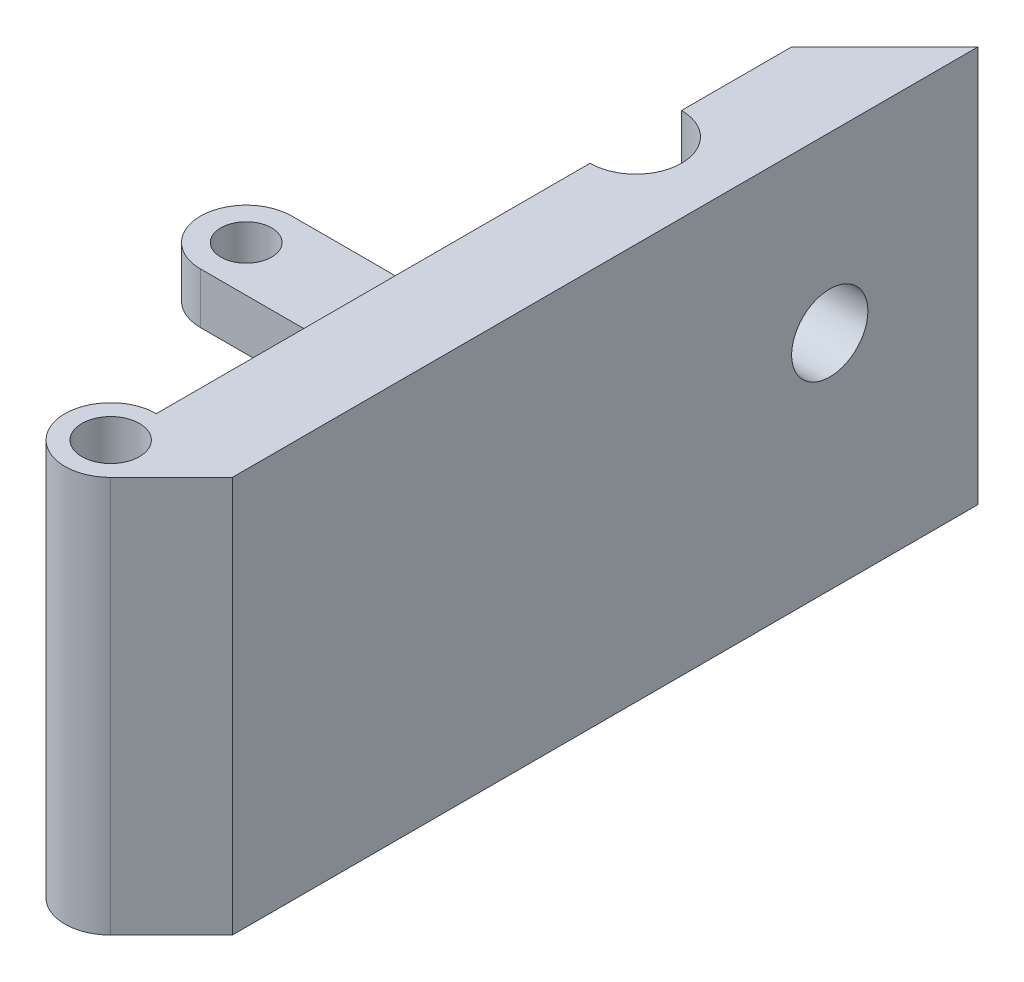
ISO-10303-21;
HEADER;
FILE_DESCRIPTION(('STEP AP214'),'2;1');
FILE_NAME('part.step','',(''),(''),'','','');
FILE_SCHEMA(('AUTOMOTIVE_DESIGN { 1 0 10303 214 1 1 1 1 }'));
ENDSEC;
DATA;
#1=APPLICATION_CONTEXT('core data for automotive mechanical design processes');
#2=APPLICATION_PROTOCOL_DEFINITION('international standard','automotive_design',2000,#1);
#3=PRODUCT_CONTEXT('',#1,'mechanical');
#4=PRODUCT('Part','Part','',(#3));
#5=PRODUCT_RELATED_PRODUCT_CATEGORY('part','',(#4));
#6=PRODUCT_DEFINITION_FORMATION('','',#4);
#7=PRODUCT_DEFINITION_CONTEXT('part definition',#1,'design');
#8=PRODUCT_DEFINITION('design','',#6,#7);
#9=PRODUCT_DEFINITION_SHAPE('','',#8);
#10=(LENGTH_UNIT() NAMED_UNIT(*) SI_UNIT(.MILLI.,.METRE.));
#11=(NAMED_UNIT(*) PLANE_ANGLE_UNIT() SI_UNIT($,.RADIAN.));
#12=(NAMED_UNIT(*) SI_UNIT($,.STERADIAN.) SOLID_ANGLE_UNIT());
#13=UNCERTAINTY_MEASURE_WITH_UNIT(LENGTH_MEASURE(1.E-05),#10,'distance_accuracy_value','');
#14=(GEOMETRIC_REPRESENTATION_CONTEXT(3) GLOBAL_UNCERTAINTY_ASSIGNED_CONTEXT((#13)) GLOBAL_UNIT_ASSIGNED_CONTEXT((#10,
#11,#12)) REPRESENTATION_CONTEXT('',''));
#15=CARTESIAN_POINT('',(0.,0.,0.));
#16=DIRECTION('',(0.,0.,1.));
#17=DIRECTION('',(1.,0.,0.));
#18=AXIS2_PLACEMENT_3D('',#15,#16,#17);
#19=CARTESIAN_POINT('',(60.,11.7,-56.7));
#20=DIRECTION('',(1.,0.,0.));
#21=DIRECTION('',(0.,0.,-1.));
#22=AXIS2_PLACEMENT_3D('',#19,#20,#21);
#23=PLANE('',#22);
#24=DIRECTION('',(0.,0.,1.));
#25=VECTOR('',#24,1.);
#26=CARTESIAN_POINT('',(60.,-6.7,-66.8));
#27=LINE('',#26,#25);
#28=CARTESIAN_POINT('',(60.,-6.7,-72.2));
#29=VERTEX_POINT('',#28);
#30=CARTESIAN_POINT('',(60.,-6.7,-66.8));
#31=VERTEX_POINT('',#30);
#32=EDGE_CURVE('E221',#29,#31,#27,.T.);
#33=ORIENTED_EDGE('',*,*,#32,.T.);
#34=DIRECTION('',(0.,-1.,0.));
#35=VECTOR('',#34,1.);
#36=CARTESIAN_POINT('',(60.,-6.7,-66.8));
#37=LINE('',#36,#35);
#38=CARTESIAN_POINT('',(60.,-9.7,-66.8));
#39=VERTEX_POINT('',#38);
#40=EDGE_CURVE('E244',#31,#39,#37,.T.);
#41=ORIENTED_EDGE('',*,*,#40,.T.);
#42=DIRECTION('',(0.,0.,1.));
#43=VECTOR('',#42,1.);
#44=CARTESIAN_POINT('',(60.,-9.7,-66.8));
#45=LINE('',#44,#43);
#46=CARTESIAN_POINT('',(60.,-9.7,-72.2));
#47=VERTEX_POINT('',#46);
#48=EDGE_CURVE('E234',#47,#39,#45,.T.);
#49=ORIENTED_EDGE('',*,*,#48,.F.);
#50=DIRECTION('',(0.,-1.,0.));
#51=VECTOR('',#50,1.);
#52=CARTESIAN_POINT('',(60.,-6.7,-72.2));
#53=LINE('',#52,#51);
#54=EDGE_CURVE('E248',#29,#47,#53,.T.);
#55=ORIENTED_EDGE('',*,*,#54,.F.);
#56=EDGE_LOOP('',(#33,#41,#49,#55));
#57=FACE_BOUND('',#56,.T.);
#58=DIRECTION('',(0.,0.,1.));
#59=VECTOR('',#58,1.);
#60=CARTESIAN_POINT('',(60.,-11.7,-56.7));
#61=LINE('',#60,#59);
#62=CARTESIAN_POINT('',(60.,-11.7,-82.3));
#63=VERTEX_POINT('',#62);
#64=CARTESIAN_POINT('',(60.,-11.7,-56.7));
#65=VERTEX_POINT('',#64);
#66=EDGE_CURVE('E297',#63,#65,#61,.T.);
#67=ORIENTED_EDGE('',*,*,#66,.T.);
#68=DIRECTION('',(0.,-1.,0.));
#69=VECTOR('',#68,1.);
#70=CARTESIAN_POINT('',(60.,11.7,-56.7));
#71=LINE('',#70,#69);
#72=CARTESIAN_POINT('',(60.,11.7,-56.7));
#73=VERTEX_POINT('',#72);
#74=EDGE_CURVE('E327',#73,#65,#71,.T.);
#75=ORIENTED_EDGE('',*,*,#74,.F.);
#76=DIRECTION('',(0.,0.,1.));
#77=VECTOR('',#76,1.);
#78=CARTESIAN_POINT('',(60.,11.7,-56.7));
#79=LINE('',#78,#77);
#80=CARTESIAN_POINT('',(60.,11.7,-82.3));
#81=VERTEX_POINT('',#80);
#82=EDGE_CURVE('E276',#81,#73,#79,.T.);
#83=ORIENTED_EDGE('',*,*,#82,.F.);
#84=DIRECTION('',(0.,-1.,0.));
#85=VECTOR('',#84,1.);
#86=CARTESIAN_POINT('',(60.,11.7,-82.3));
#87=LINE('',#86,#85);
#88=EDGE_CURVE('E48',#81,#63,#87,.T.);
#89=ORIENTED_EDGE('',*,*,#88,.T.);
#90=EDGE_LOOP('',(#67,#75,#83,#89));
#91=FACE_BOUND('',#90,.T.);
#92=DIRECTION('',(0.,0.,1.));
#93=VECTOR('',#92,1.);
#94=CARTESIAN_POINT('',(60.,10.3,-66.8));
#95=LINE('',#94,#93);
#96=CARTESIAN_POINT('',(60.,10.3,-72.2));
#97=VERTEX_POINT('',#96);
#98=CARTESIAN_POINT('',(60.,10.3,-66.8));
#99=VERTEX_POINT('',#98);
#100=EDGE_CURVE('E167',#97,#99,#95,.T.);
#101=ORIENTED_EDGE('',*,*,#100,.T.);
#102=DIRECTION('',(0.,-1.,0.));
#103=VECTOR('',#102,1.);
#104=CARTESIAN_POINT('',(60.,10.3,-66.8));
#105=LINE('',#104,#103);
#106=CARTESIAN_POINT('',(60.,7.3,-66.8));
#107=VERTEX_POINT('',#106);
#108=EDGE_CURVE('E198',#99,#107,#105,.T.);
#109=ORIENTED_EDGE('',*,*,#108,.T.);
#110=DIRECTION('',(0.,0.,1.));
#111=VECTOR('',#110,1.);
#112=CARTESIAN_POINT('',(60.,7.3,-66.8));
#113=LINE('',#112,#111);
#114=CARTESIAN_POINT('',(60.,7.3,-72.2));
#115=VERTEX_POINT('',#114);
#116=EDGE_CURVE('E177',#115,#107,#113,.T.);
#117=ORIENTED_EDGE('',*,*,#116,.F.);
#118=DIRECTION('',(0.,-1.,0.));
#119=VECTOR('',#118,1.);
#120=CARTESIAN_POINT('',(60.,10.3,-72.2));
#121=LINE('',#120,#119);
#122=EDGE_CURVE('E157',#97,#115,#121,.T.);
#123=ORIENTED_EDGE('',*,*,#122,.F.);
#124=EDGE_LOOP('',(#101,#109,#117,#123));
#125=FACE_BOUND('',#124,.T.);
#126=ADVANCED_FACE('F39',(#57,#91,#125),#23,.F.);
#127=CARTESIAN_POINT('',(60.,11.7,-54.));
#128=DIRECTION('',(0.,1.,0.));
#129=DIRECTION('',(0.,0.,1.));
#130=AXIS2_PLACEMENT_3D('',#127,#128,#129);
#131=PLANE('',#130);
#132=DIRECTION('',(0.,0.,1.));
#133=VECTOR('',#132,1.);
#134=CARTESIAN_POINT('',(60.,11.7,-93.2));
#135=LINE('',#134,#133);
#136=CARTESIAN_POINT('',(60.,11.7,-94.2));
#137=VERTEX_POINT('',#136);
#138=CARTESIAN_POINT('',(60.,11.7,-87.7));
#139=VERTEX_POINT('',#138);
#140=EDGE_CURVE('E269',#137,#139,#135,.T.);
#141=ORIENTED_EDGE('',*,*,#140,.T.);
#142=CARTESIAN_POINT('',(60.,11.7,-85.));
#143=DIRECTION('',(0.,-1.,0.));
#144=DIRECTION('',(0.,0.,1.));
#145=AXIS2_PLACEMENT_3D('',#142,#143,#144);
#146=CIRCLE('',#145,2.69999999999999);
#147=EDGE_CURVE('E272',#139,#81,#146,.T.);
#148=ORIENTED_EDGE('',*,*,#147,.T.);
#149=ORIENTED_EDGE('',*,*,#82,.T.);
#150=CARTESIAN_POINT('',(60.,11.7,-54.));
#151=DIRECTION('',(0.,1.,0.));
#152=DIRECTION('',(0.,0.,1.));
#153=AXIS2_PLACEMENT_3D('',#150,#151,#152);
#154=CIRCLE('',#153,2.7);
#155=CARTESIAN_POINT('',(61.9091883092037,11.7,-52.0908116907963));
#156=VERTEX_POINT('',#155);
#157=EDGE_CURVE('E279',#73,#156,#154,.T.);
#158=ORIENTED_EDGE('',*,*,#157,.T.);
#159=DIRECTION('',(0.707106781186543,0.,-0.707106781186552));
#160=VECTOR('',#159,1.);
#161=CARTESIAN_POINT('',(61.9091883092037,11.7,-52.0908116907963));
#162=LINE('',#161,#160);
#163=CARTESIAN_POINT('',(65.5,11.7,-55.6816233815927));
#164=VERTEX_POINT('',#163);
#165=EDGE_CURVE('E282',#156,#164,#162,.T.);
#166=ORIENTED_EDGE('',*,*,#165,.T.);
#167=DIRECTION('',(0.,0.,-1.));
#168=VECTOR('',#167,1.);
#169=CARTESIAN_POINT('',(65.5,11.7,-99.7));
#170=LINE('',#169,#168);
#171=CARTESIAN_POINT('',(65.5,11.7,-99.7));
#172=VERTEX_POINT('',#171);
#173=EDGE_CURVE('E285',#164,#172,#170,.T.);
#174=ORIENTED_EDGE('',*,*,#173,.T.);
#175=DIRECTION('',(-0.707106781186548,0.,0.707106781186547));
#176=VECTOR('',#175,1.);
#177=CARTESIAN_POINT('',(60.,11.7,-94.2));
#178=LINE('',#177,#176);
#179=EDGE_CURVE('E288',#172,#137,#178,.T.);
#180=ORIENTED_EDGE('',*,*,#179,.T.);
#181=EDGE_LOOP('',(#141,#148,#149,#158,#166,#174,#180));
#182=FACE_BOUND('',#181,.T.);
#183=CARTESIAN_POINT('',(60.,11.7,-54.));
#184=DIRECTION('',(0.,1.,0.));
#185=DIRECTION('',(0.,0.,1.));
#186=AXIS2_PLACEMENT_3D('',#183,#184,#185);
#187=CIRCLE('',#186,1.7);
#188=CARTESIAN_POINT('',(60.,11.7,-52.3));
#189=VERTEX_POINT('',#188);
#190=EDGE_CURVE('E261',#189,#189,#187,.T.);
#191=ORIENTED_EDGE('',*,*,#190,.F.);
#192=EDGE_LOOP('',(#191));
#193=FACE_BOUND('',#192,.T.);
#194=ADVANCED_FACE('F357',(#182,#193),#131,.T.);
#195=CARTESIAN_POINT('',(60.,-11.7,-54.));
#196=DIRECTION('',(0.,1.,0.));
#197=DIRECTION('',(0.,0.,1.));
#198=AXIS2_PLACEMENT_3D('',#195,#196,#197);
#199=PLANE('',#198);
#200=DIRECTION('',(0.,0.,1.));
#201=VECTOR('',#200,1.);
#202=CARTESIAN_POINT('',(60.,-11.7,-87.7));
#203=LINE('',#202,#201);
#204=CARTESIAN_POINT('',(60.,-11.7,-94.2));
#205=VERTEX_POINT('',#204);
#206=CARTESIAN_POINT('',(60.,-11.7,-87.7));
#207=VERTEX_POINT('',#206);
#208=EDGE_CURVE('E265',#205,#207,#203,.T.);
#209=ORIENTED_EDGE('',*,*,#208,.F.);
#210=DIRECTION('',(-0.707106781186548,0.,0.707106781186547));
#211=VECTOR('',#210,1.);
#212=CARTESIAN_POINT('',(60.,-11.7,-94.2));
#213=LINE('',#212,#211);
#214=CARTESIAN_POINT('',(65.5,-11.7,-99.7));
#215=VERTEX_POINT('',#214);
#216=EDGE_CURVE('E273',#215,#205,#213,.T.);
#217=ORIENTED_EDGE('',*,*,#216,.F.);
#218=DIRECTION('',(0.,0.,-1.));
#219=VECTOR('',#218,1.);
#220=CARTESIAN_POINT('',(65.5,-11.7,-99.7));
#221=LINE('',#220,#219);
#222=CARTESIAN_POINT('',(65.5,-11.7,-55.6816233815927));
#223=VERTEX_POINT('',#222);
#224=EDGE_CURVE('E306',#223,#215,#221,.T.);
#225=ORIENTED_EDGE('',*,*,#224,.F.);
#226=DIRECTION('',(0.707106781186543,0.,-0.707106781186552));
#227=VECTOR('',#226,1.);
#228=CARTESIAN_POINT('',(61.9091883092037,-11.7,-52.0908116907963));
#229=LINE('',#228,#227);
#230=CARTESIAN_POINT('',(61.9091883092037,-11.7,-52.0908116907963));
#231=VERTEX_POINT('',#230);
#232=EDGE_CURVE('E303',#231,#223,#229,.T.);
#233=ORIENTED_EDGE('',*,*,#232,.F.);
#234=CARTESIAN_POINT('',(60.,-11.7,-54.));
#235=DIRECTION('',(0.,1.,0.));
#236=DIRECTION('',(0.,0.,1.));
#237=AXIS2_PLACEMENT_3D('',#234,#235,#236);
#238=CIRCLE('',#237,2.7);
#239=EDGE_CURVE('E300',#65,#231,#238,.T.);
#240=ORIENTED_EDGE('',*,*,#239,.F.);
#241=ORIENTED_EDGE('',*,*,#66,.F.);
#242=CARTESIAN_POINT('',(60.,-11.7,-85.));
#243=DIRECTION('',(0.,-1.,0.));
#244=DIRECTION('',(0.,0.,1.));
#245=AXIS2_PLACEMENT_3D('',#242,#243,#244);
#246=CIRCLE('',#245,2.69999999999999);
#247=EDGE_CURVE('E294',#207,#63,#246,.T.);
#248=ORIENTED_EDGE('',*,*,#247,.F.);
#249=EDGE_LOOP('',(#209,#217,#225,#233,#240,#241,#248));
#250=FACE_BOUND('',#249,.T.);
#251=CARTESIAN_POINT('',(60.,-11.7,-54.));
#252=DIRECTION('',(0.,1.,0.));
#253=DIRECTION('',(0.,0.,1.));
#254=AXIS2_PLACEMENT_3D('',#251,#252,#253);
#255=CIRCLE('',#254,1.7);
#256=CARTESIAN_POINT('',(60.,-11.7,-52.3));
#257=VERTEX_POINT('',#256);
#258=EDGE_CURVE('E260',#257,#257,#255,.T.);
#259=ORIENTED_EDGE('',*,*,#258,.T.);
#260=EDGE_LOOP('',(#259));
#261=FACE_BOUND('',#260,.T.);
#262=ADVANCED_FACE('F343',(#250,#261),#199,.F.);
#263=CARTESIAN_POINT('',(60.,11.7,-87.7));
#264=DIRECTION('',(1.,0.,0.));
#265=DIRECTION('',(0.,0.,-1.));
#266=AXIS2_PLACEMENT_3D('',#263,#264,#265);
#267=PLANE('',#266);
#268=CARTESIAN_POINT('',(60.,1.45,-90.95));
#269=DIRECTION('',(1.,0.,0.));
#270=DIRECTION('',(0.,0.,-1.));
#271=AXIS2_PLACEMENT_3D('',#268,#269,#270);
#272=CIRCLE('',#271,2.25);
#273=CARTESIAN_POINT('',(60.,1.45,-93.2));
#274=VERTEX_POINT('',#273);
#275=EDGE_CURVE('E256',#274,#274,#272,.T.);
#276=ORIENTED_EDGE('',*,*,#275,.T.);
#277=EDGE_LOOP('',(#276));
#278=FACE_BOUND('',#277,.T.);
#279=ORIENTED_EDGE('',*,*,#208,.T.);
#280=DIRECTION('',(0.,-1.,0.));
#281=VECTOR('',#280,1.);
#282=CARTESIAN_POINT('',(60.,11.7,-87.7));
#283=LINE('',#282,#281);
#284=EDGE_CURVE('E11',#139,#207,#283,.T.);
#285=ORIENTED_EDGE('',*,*,#284,.F.);
#286=ORIENTED_EDGE('',*,*,#140,.F.);
#287=DIRECTION('',(0.,-1.,0.));
#288=VECTOR('',#287,1.);
#289=CARTESIAN_POINT('',(60.,11.7,-94.2));
#290=LINE('',#289,#288);
#291=EDGE_CURVE('E291',#137,#205,#290,.T.);
#292=ORIENTED_EDGE('',*,*,#291,.T.);
#293=EDGE_LOOP('',(#279,#285,#286,#292));
#294=FACE_BOUND('',#293,.T.);
#295=ADVANCED_FACE('F41',(#278,#294),#267,.F.);
#296=CARTESIAN_POINT('',(60.,11.7,-85.));
#297=DIRECTION('',(0.,-1.,0.));
#298=DIRECTION('',(0.,0.,-1.));
#299=AXIS2_PLACEMENT_3D('',#296,#297,#298);
#300=CYLINDRICAL_SURFACE('',#299,2.69999999999999);
#301=ORIENTED_EDGE('',*,*,#247,.T.);
#302=ORIENTED_EDGE('',*,*,#88,.F.);
#303=ORIENTED_EDGE('',*,*,#147,.F.);
#304=ORIENTED_EDGE('',*,*,#284,.T.);
#305=EDGE_LOOP('',(#301,#302,#303,#304));
#306=FACE_BOUND('',#305,.T.);
#307=ADVANCED_FACE('F362',(#306),#300,.F.);
#308=CARTESIAN_POINT('',(60.,11.7,-54.));
#309=DIRECTION('',(0.,-1.,0.));
#310=DIRECTION('',(0.,0.,-1.));
#311=AXIS2_PLACEMENT_3D('',#308,#309,#310);
#312=CYLINDRICAL_SURFACE('',#311,2.7);
#313=ORIENTED_EDGE('',*,*,#239,.T.);
#314=DIRECTION('',(0.,-1.,0.));
#315=VECTOR('',#314,1.);
#316=CARTESIAN_POINT('',(61.9091883092037,11.7,-52.0908116907963));
#317=LINE('',#316,#315);
#318=EDGE_CURVE('E323',#156,#231,#317,.T.);
#319=ORIENTED_EDGE('',*,*,#318,.F.);
#320=ORIENTED_EDGE('',*,*,#157,.F.);
#321=ORIENTED_EDGE('',*,*,#74,.T.);
#322=EDGE_LOOP('',(#313,#319,#320,#321));
#323=FACE_BOUND('',#322,.T.);
#324=ADVANCED_FACE('F349',(#323),#312,.T.);
#325=CARTESIAN_POINT('',(61.9091883092037,11.7,-52.0908116907963));
#326=DIRECTION('',(-0.707106781186552,0.,-0.707106781186543));
#327=DIRECTION('',(-0.707106781186543,0.,0.707106781186552));
#328=AXIS2_PLACEMENT_3D('',#325,#326,#327);
#329=PLANE('',#328);
#330=ORIENTED_EDGE('',*,*,#232,.T.);
#331=DIRECTION('',(0.,-1.,0.));
#332=VECTOR('',#331,1.);
#333=CARTESIAN_POINT('',(65.5,11.7,-55.6816233815927));
#334=LINE('',#333,#332);
#335=EDGE_CURVE('E319',#164,#223,#334,.T.);
#336=ORIENTED_EDGE('',*,*,#335,.F.);
#337=ORIENTED_EDGE('',*,*,#165,.F.);
#338=ORIENTED_EDGE('',*,*,#318,.T.);
#339=EDGE_LOOP('',(#330,#336,#337,#338));
#340=FACE_BOUND('',#339,.T.);
#341=ADVANCED_FACE('F353',(#340),#329,.F.);
#342=CARTESIAN_POINT('',(65.5,11.7,-99.7));
#343=DIRECTION('',(-1.,0.,0.));
#344=DIRECTION('',(0.,0.,1.));
#345=AXIS2_PLACEMENT_3D('',#342,#343,#344);
#346=PLANE('',#345);
#347=CARTESIAN_POINT('',(65.5,1.45,-90.95));
#348=DIRECTION('',(1.,0.,0.));
#349=DIRECTION('',(0.,0.,-1.));
#350=AXIS2_PLACEMENT_3D('',#347,#348,#349);
#351=CIRCLE('',#350,2.25);
#352=CARTESIAN_POINT('',(65.5,1.45,-93.2));
#353=VERTEX_POINT('',#352);
#354=EDGE_CURVE('E243',#353,#353,#351,.T.);
#355=ORIENTED_EDGE('',*,*,#354,.F.);
#356=EDGE_LOOP('',(#355));
#357=FACE_BOUND('',#356,.T.);
#358=ORIENTED_EDGE('',*,*,#224,.T.);
#359=DIRECTION('',(0.,-1.,0.));
#360=VECTOR('',#359,1.);
#361=CARTESIAN_POINT('',(65.5,11.7,-99.7));
#362=LINE('',#361,#360);
#363=EDGE_CURVE('E315',#172,#215,#362,.T.);
#364=ORIENTED_EDGE('',*,*,#363,.F.);
#365=ORIENTED_EDGE('',*,*,#173,.F.);
#366=ORIENTED_EDGE('',*,*,#335,.T.);
#367=EDGE_LOOP('',(#358,#364,#365,#366));
#368=FACE_BOUND('',#367,.T.);
#369=ADVANCED_FACE('F370',(#357,#368),#346,.F.);
#370=CARTESIAN_POINT('',(60.,11.7,-94.2));
#371=DIRECTION('',(0.707106781186547,0.,0.707106781186548));
#372=DIRECTION('',(0.707106781186548,0.,-0.707106781186547));
#373=AXIS2_PLACEMENT_3D('',#370,#371,#372);
#374=PLANE('',#373);
#375=ORIENTED_EDGE('',*,*,#216,.T.);
#376=ORIENTED_EDGE('',*,*,#291,.F.);
#377=ORIENTED_EDGE('',*,*,#179,.F.);
#378=ORIENTED_EDGE('',*,*,#363,.T.);
#379=EDGE_LOOP('',(#375,#376,#377,#378));
#380=FACE_BOUND('',#379,.T.);
#381=ADVANCED_FACE('F367',(#380),#374,.F.);
#382=CARTESIAN_POINT('',(60.,11.7,-54.));
#383=DIRECTION('',(0.,-1.,0.));
#384=DIRECTION('',(0.,0.,-1.));
#385=AXIS2_PLACEMENT_3D('',#382,#383,#384);
#386=CYLINDRICAL_SURFACE('',#385,1.7);
#387=ORIENTED_EDGE('',*,*,#190,.T.);
#388=EDGE_LOOP('',(#387));
#389=FACE_BOUND('',#388,.T.);
#390=ORIENTED_EDGE('',*,*,#258,.F.);
#391=EDGE_LOOP('',(#390));
#392=FACE_BOUND('',#391,.T.);
#393=ADVANCED_FACE('F378',(#389,#392),#386,.F.);
#394=CARTESIAN_POINT('',(57.3,1.45,-90.95));
#395=DIRECTION('',(1.,0.,0.));
#396=DIRECTION('',(0.,0.,-1.));
#397=AXIS2_PLACEMENT_3D('',#394,#395,#396);
#398=CYLINDRICAL_SURFACE('',#397,2.25);
#399=CARTESIAN_POINT('',(65.5,1.45,-93.2));
#400=CARTESIAN_POINT('',(65.4427083333333,1.45,-93.2));
#401=CARTESIAN_POINT('',(65.3854166666667,1.45,-93.2));
#402=CARTESIAN_POINT('',(65.2708333333333,1.45,-93.2));
#403=CARTESIAN_POINT('',(65.2135416666667,1.45,-93.2));
#404=CARTESIAN_POINT('',(65.0989583333333,1.45,-93.2));
#405=CARTESIAN_POINT('',(65.0416666666667,1.45,-93.2));
#406=CARTESIAN_POINT('',(64.9270833333333,1.45,-93.2));
#407=CARTESIAN_POINT('',(64.8697916666666,1.45,-93.2));
#408=CARTESIAN_POINT('',(64.7552083333333,1.45,-93.2));
#409=CARTESIAN_POINT('',(64.6979166666666,1.45,-93.2));
#410=CARTESIAN_POINT('',(64.5833333333333,1.45,-93.2));
#411=CARTESIAN_POINT('',(64.5260416666667,1.45,-93.2));
#412=CARTESIAN_POINT('',(64.4114583333333,1.45,-93.2));
#413=CARTESIAN_POINT('',(64.3541666666667,1.45,-93.2));
#414=CARTESIAN_POINT('',(64.2395833333333,1.45,-93.2));
#415=CARTESIAN_POINT('',(64.1822916666667,1.45,-93.2));
#416=CARTESIAN_POINT('',(64.0677083333333,1.45,-93.2));
#417=CARTESIAN_POINT('',(64.0104166666667,1.45,-93.2));
#418=CARTESIAN_POINT('',(63.8958333333333,1.45,-93.2));
#419=CARTESIAN_POINT('',(63.8385416666667,1.45,-93.2));
#420=CARTESIAN_POINT('',(63.7239583333333,1.45,-93.2));
#421=CARTESIAN_POINT('',(63.6666666666667,1.45,-93.2));
#422=CARTESIAN_POINT('',(63.5520833333333,1.45,-93.2));
#423=CARTESIAN_POINT('',(63.4947916666667,1.45,-93.2));
#424=CARTESIAN_POINT('',(63.3802083333333,1.45,-93.2));
#425=CARTESIAN_POINT('',(63.3229166666667,1.45,-93.2));
#426=CARTESIAN_POINT('',(63.2083333333333,1.45,-93.2));
#427=CARTESIAN_POINT('',(63.1510416666667,1.45,-93.2));
#428=CARTESIAN_POINT('',(63.0364583333333,1.45,-93.2));
#429=CARTESIAN_POINT('',(62.9791666666667,1.45,-93.2));
#430=CARTESIAN_POINT('',(62.8645833333333,1.45,-93.2));
#431=CARTESIAN_POINT('',(62.8072916666667,1.45,-93.2));
#432=CARTESIAN_POINT('',(62.6927083333333,1.45,-93.2));
#433=CARTESIAN_POINT('',(62.6354166666667,1.45,-93.2));
#434=CARTESIAN_POINT('',(62.5208333333333,1.45,-93.2));
#435=CARTESIAN_POINT('',(62.4635416666667,1.45,-93.2));
#436=CARTESIAN_POINT('',(62.3489583333333,1.45,-93.2));
#437=CARTESIAN_POINT('',(62.2916666666667,1.45,-93.2));
#438=CARTESIAN_POINT('',(62.1770833333333,1.45,-93.2));
#439=CARTESIAN_POINT('',(62.1197916666667,1.45,-93.2));
#440=CARTESIAN_POINT('',(62.0052083333333,1.45,-93.2));
#441=CARTESIAN_POINT('',(61.9479166666667,1.45,-93.2));
#442=CARTESIAN_POINT('',(61.8333333333333,1.45,-93.2));
#443=CARTESIAN_POINT('',(61.7760416666667,1.45,-93.2));
#444=CARTESIAN_POINT('',(61.6614583333333,1.45,-93.2));
#445=CARTESIAN_POINT('',(61.6041666666667,1.45,-93.2));
#446=CARTESIAN_POINT('',(61.4895833333333,1.45,-93.2));
#447=CARTESIAN_POINT('',(61.4322916666667,1.45,-93.2));
#448=CARTESIAN_POINT('',(61.3177083333333,1.45,-93.2));
#449=CARTESIAN_POINT('',(61.2604166666667,1.45,-93.2));
#450=CARTESIAN_POINT('',(61.1458333333333,1.45,-93.2));
#451=CARTESIAN_POINT('',(61.0885416666667,1.45,-93.2));
#452=CARTESIAN_POINT('',(60.9739583333333,1.45,-93.2));
#453=CARTESIAN_POINT('',(60.9166666666667,1.45,-93.2));
#454=CARTESIAN_POINT('',(60.8020833333333,1.45,-93.2));
#455=CARTESIAN_POINT('',(60.7447916666667,1.45,-93.2));
#456=CARTESIAN_POINT('',(60.6302083333333,1.45,-93.2));
#457=CARTESIAN_POINT('',(60.5729166666667,1.45,-93.2));
#458=CARTESIAN_POINT('',(60.4583333333333,1.45,-93.2));
#459=CARTESIAN_POINT('',(60.4010416666667,1.45,-93.2));
#460=CARTESIAN_POINT('',(60.2864583333333,1.45,-93.2));
#461=CARTESIAN_POINT('',(60.2291666666667,1.45,-93.2));
#462=CARTESIAN_POINT('',(60.1145833333333,1.45,-93.2));
#463=CARTESIAN_POINT('',(60.0572916666667,1.45,-93.2));
#464=CARTESIAN_POINT('',(60.,1.45,-93.2));
#465=B_SPLINE_CURVE_WITH_KNOTS('',3,(#399,#400,#401,#402,#403,#404,#405,#406,#407,#408,#409,
#410,#411,#412,#413,#414,#415,#416,#417,#418,#419,#420,#421,#422,#423,#424,#425,#426,#427,#428,
#429,#430,#431,#432,#433,#434,#435,#436,#437,#438,#439,#440,#441,#442,#443,#444,#445,#446,#447,
#448,#449,#450,#451,#452,#453,#454,#455,#456,#457,#458,#459,#460,#461,#462,#463,#464),
.UNSPECIFIED.,.F.,.F.,(4,2,2,2,2,2,2,2,2,2,2,2,2,2,2,2,2,2,2,2,2,2,2,2,2,2,2,2,2,2,2,2,4),(0.,
0.171875000000002,0.343750000000004,0.515625000000006,0.687500000000008,0.859375000000009,
1.03125,1.203125,1.375,1.546875,1.71875,1.89062500000001,2.06250000000001,2.234375,2.40625,
2.578125,2.75,2.921875,3.09375000000001,3.265625,3.4375,3.609375,3.78125,3.953125,4.125,
4.296875,4.46875,4.640625,4.8125,4.984375,5.15625,5.328125,5.5),.UNSPECIFIED.);
#466=EDGE_CURVE('BSEAM404',#353,#274,#465,.T.);
#467=ORIENTED_EDGE('',*,*,#354,.T.);
#468=ORIENTED_EDGE('',*,*,#275,.F.);
#469=ORIENTED_EDGE('',*,*,#466,.T.);
#470=ORIENTED_EDGE('',*,*,#466,.F.);
#471=EDGE_LOOP('',(#467,#469,#468,#470));
#472=FACE_BOUND('',#471,.T.);
#473=ADVANCED_FACE('F404',(#472),#398,.F.);
#474=CARTESIAN_POINT('',(52.5,-6.7,-69.5));
#475=DIRECTION('',(0.,-1.,0.));
#476=DIRECTION('',(0.,0.,-1.));
#477=AXIS2_PLACEMENT_3D('',#474,#475,#476);
#478=CYLINDRICAL_SURFACE('',#477,2.69999999999999);
#479=CARTESIAN_POINT('',(52.5,-9.7,-69.5));
#480=DIRECTION('',(0.,-1.,0.));
#481=DIRECTION('',(0.,0.,-1.));
#482=AXIS2_PLACEMENT_3D('',#479,#480,#481);
#483=CIRCLE('',#482,2.69999999999999);
#484=CARTESIAN_POINT('',(52.5,-9.7,-66.8));
#485=VERTEX_POINT('',#484);
#486=CARTESIAN_POINT('',(52.5,-9.7,-72.2));
#487=VERTEX_POINT('',#486);
#488=EDGE_CURVE('E208',#485,#487,#483,.T.);
#489=ORIENTED_EDGE('',*,*,#488,.F.);
#490=DIRECTION('',(0.,-1.,0.));
#491=VECTOR('',#490,1.);
#492=CARTESIAN_POINT('',(52.5,-6.7,-66.8));
#493=LINE('',#492,#491);
#494=CARTESIAN_POINT('',(52.5,-6.7,-66.8));
#495=VERTEX_POINT('',#494);
#496=EDGE_CURVE('E240',#495,#485,#493,.T.);
#497=ORIENTED_EDGE('',*,*,#496,.F.);
#498=CARTESIAN_POINT('',(52.5,-6.7,-69.5));
#499=DIRECTION('',(0.,-1.,0.));
#500=DIRECTION('',(0.,0.,-1.));
#501=AXIS2_PLACEMENT_3D('',#498,#499,#500);
#502=CIRCLE('',#501,2.69999999999999);
#503=CARTESIAN_POINT('',(52.5,-6.7,-72.2));
#504=VERTEX_POINT('',#503);
#505=EDGE_CURVE('E212',#495,#504,#502,.T.);
#506=ORIENTED_EDGE('',*,*,#505,.T.);
#507=DIRECTION('',(0.,-1.,0.));
#508=VECTOR('',#507,1.);
#509=CARTESIAN_POINT('',(52.5,-6.7,-72.2));
#510=LINE('',#509,#508);
#511=EDGE_CURVE('E229',#504,#487,#510,.T.);
#512=ORIENTED_EDGE('',*,*,#511,.T.);
#513=EDGE_LOOP('',(#489,#497,#506,#512));
#514=FACE_BOUND('',#513,.T.);
#515=ADVANCED_FACE('F406',(#514),#478,.T.);
#516=CARTESIAN_POINT('',(52.5,-6.7,-66.8));
#517=DIRECTION('',(0.,0.,1.));
#518=DIRECTION('',(1.,0.,0.));
#519=AXIS2_PLACEMENT_3D('',#516,#517,#518);
#520=PLANE('',#519);
#521=DIRECTION('',(-1.,0.,0.));
#522=VECTOR('',#521,1.);
#523=CARTESIAN_POINT('',(52.5,-9.7,-66.8));
#524=LINE('',#523,#522);
#525=EDGE_CURVE('E217',#39,#485,#524,.T.);
#526=ORIENTED_EDGE('',*,*,#525,.F.);
#527=ORIENTED_EDGE('',*,*,#40,.F.);
#528=DIRECTION('',(-1.,0.,0.));
#529=VECTOR('',#528,1.);
#530=CARTESIAN_POINT('',(52.5,-6.7,-66.8));
#531=LINE('',#530,#529);
#532=EDGE_CURVE('E225',#31,#495,#531,.T.);
#533=ORIENTED_EDGE('',*,*,#532,.T.);
#534=ORIENTED_EDGE('',*,*,#496,.T.);
#535=EDGE_LOOP('',(#526,#527,#533,#534));
#536=FACE_BOUND('',#535,.T.);
#537=ADVANCED_FACE('F413',(#536),#520,.T.);
#538=CARTESIAN_POINT('',(52.5,-6.7,-72.2));
#539=DIRECTION('',(0.,0.,-1.));
#540=DIRECTION('',(-1.,0.,0.));
#541=AXIS2_PLACEMENT_3D('',#538,#539,#540);
#542=PLANE('',#541);
#543=DIRECTION('',(1.,0.,0.));
#544=VECTOR('',#543,1.);
#545=CARTESIAN_POINT('',(52.5,-9.7,-72.2));
#546=LINE('',#545,#544);
#547=EDGE_CURVE('E63',#487,#47,#546,.T.);
#548=ORIENTED_EDGE('',*,*,#547,.F.);
#549=ORIENTED_EDGE('',*,*,#511,.F.);
#550=DIRECTION('',(1.,0.,0.));
#551=VECTOR('',#550,1.);
#552=CARTESIAN_POINT('',(52.5,-6.7,-72.2));
#553=LINE('',#552,#551);
#554=EDGE_CURVE('E216',#504,#29,#553,.T.);
#555=ORIENTED_EDGE('',*,*,#554,.T.);
#556=ORIENTED_EDGE('',*,*,#54,.T.);
#557=EDGE_LOOP('',(#548,#549,#555,#556));
#558=FACE_BOUND('',#557,.T.);
#559=ADVANCED_FACE('F419',(#558),#542,.T.);
#560=CARTESIAN_POINT('',(52.5,-6.7,-69.5));
#561=DIRECTION('',(0.,-1.,0.));
#562=DIRECTION('',(0.,0.,-1.));
#563=AXIS2_PLACEMENT_3D('',#560,#561,#562);
#564=PLANE('',#563);
#565=CARTESIAN_POINT('',(52.5,-6.7,-69.5));
#566=DIRECTION('',(0.,-1.,0.));
#567=DIRECTION('',(0.,0.,-1.));
#568=AXIS2_PLACEMENT_3D('',#565,#566,#567);
#569=CIRCLE('',#568,1.5);
#570=CARTESIAN_POINT('',(52.5,-6.7,-71.));
#571=VERTEX_POINT('',#570);
#572=EDGE_CURVE('E204',#571,#571,#569,.T.);
#573=ORIENTED_EDGE('',*,*,#572,.T.);
#574=EDGE_LOOP('',(#573));
#575=FACE_BOUND('',#574,.T.);
#576=ORIENTED_EDGE('',*,*,#505,.F.);
#577=ORIENTED_EDGE('',*,*,#532,.F.);
#578=ORIENTED_EDGE('',*,*,#32,.F.);
#579=ORIENTED_EDGE('',*,*,#554,.F.);
#580=EDGE_LOOP('',(#576,#577,#578,#579));
#581=FACE_BOUND('',#580,.T.);
#582=ADVANCED_FACE('F422',(#575,#581),#564,.F.);
#583=CARTESIAN_POINT('',(52.5,-9.7,-69.5));
#584=DIRECTION('',(0.,-1.,0.));
#585=DIRECTION('',(0.,0.,-1.));
#586=AXIS2_PLACEMENT_3D('',#583,#584,#585);
#587=PLANE('',#586);
#588=CARTESIAN_POINT('',(52.5,-9.7,-69.5));
#589=DIRECTION('',(0.,-1.,0.));
#590=DIRECTION('',(0.,0.,-1.));
#591=AXIS2_PLACEMENT_3D('',#588,#589,#590);
#592=CIRCLE('',#591,1.5);
#593=CARTESIAN_POINT('',(52.5,-9.7,-71.));
#594=VERTEX_POINT('',#593);
#595=EDGE_CURVE('E197',#594,#594,#592,.T.);
#596=ORIENTED_EDGE('',*,*,#595,.F.);
#597=EDGE_LOOP('',(#596));
#598=FACE_BOUND('',#597,.T.);
#599=ORIENTED_EDGE('',*,*,#488,.T.);
#600=ORIENTED_EDGE('',*,*,#547,.T.);
#601=ORIENTED_EDGE('',*,*,#48,.T.);
#602=ORIENTED_EDGE('',*,*,#525,.T.);
#603=EDGE_LOOP('',(#599,#600,#601,#602));
#604=FACE_BOUND('',#603,.T.);
#605=ADVANCED_FACE('F427',(#598,#604),#587,.T.);
#606=CARTESIAN_POINT('',(52.5,-6.7,-69.5));
#607=DIRECTION('',(0.,-1.,0.));
#608=DIRECTION('',(0.,0.,-1.));
#609=AXIS2_PLACEMENT_3D('',#606,#607,#608);
#610=CYLINDRICAL_SURFACE('',#609,1.5);
#611=ORIENTED_EDGE('',*,*,#572,.F.);
#612=EDGE_LOOP('',(#611));
#613=FACE_BOUND('',#612,.T.);
#614=ORIENTED_EDGE('',*,*,#595,.T.);
#615=EDGE_LOOP('',(#614));
#616=FACE_BOUND('',#615,.T.);
#617=ADVANCED_FACE('F430',(#613,#616),#610,.F.);
#618=CARTESIAN_POINT('',(52.5,10.3,-69.5));
#619=DIRECTION('',(0.,-1.,0.));
#620=DIRECTION('',(0.,0.,-1.));
#621=AXIS2_PLACEMENT_3D('',#618,#619,#620);
#622=CYLINDRICAL_SURFACE('',#621,2.69999999999999);
#623=CARTESIAN_POINT('',(52.5,7.3,-69.5));
#624=DIRECTION('',(0.,-1.,0.));
#625=DIRECTION('',(0.,0.,-1.));
#626=AXIS2_PLACEMENT_3D('',#623,#624,#625);
#627=CIRCLE('',#626,2.69999999999999);
#628=CARTESIAN_POINT('',(52.5,7.3,-66.8));
#629=VERTEX_POINT('',#628);
#630=CARTESIAN_POINT('',(52.5,7.3,-72.2));
#631=VERTEX_POINT('',#630);
#632=EDGE_CURVE('E187',#629,#631,#627,.T.);
#633=ORIENTED_EDGE('',*,*,#632,.F.);
#634=DIRECTION('',(0.,-1.,0.));
#635=VECTOR('',#634,1.);
#636=CARTESIAN_POINT('',(52.5,10.3,-66.8));
#637=LINE('',#636,#635);
#638=CARTESIAN_POINT('',(52.5,10.3,-66.8));
#639=VERTEX_POINT('',#638);
#640=EDGE_CURVE('E171',#639,#629,#637,.T.);
#641=ORIENTED_EDGE('',*,*,#640,.F.);
#642=CARTESIAN_POINT('',(52.5,10.3,-69.5));
#643=DIRECTION('',(0.,-1.,0.));
#644=DIRECTION('',(0.,0.,-1.));
#645=AXIS2_PLACEMENT_3D('',#642,#643,#644);
#646=CIRCLE('',#645,2.69999999999999);
#647=CARTESIAN_POINT('',(52.5,10.3,-72.2));
#648=VERTEX_POINT('',#647);
#649=EDGE_CURVE('E164',#639,#648,#646,.T.);
#650=ORIENTED_EDGE('',*,*,#649,.T.);
#651=DIRECTION('',(0.,-1.,0.));
#652=VECTOR('',#651,1.);
#653=CARTESIAN_POINT('',(52.5,10.3,-72.2));
#654=LINE('',#653,#652);
#655=EDGE_CURVE('E148',#648,#631,#654,.T.);
#656=ORIENTED_EDGE('',*,*,#655,.T.);
#657=EDGE_LOOP('',(#633,#641,#650,#656));
#658=FACE_BOUND('',#657,.T.);
#659=ADVANCED_FACE('F170',(#658),#622,.T.);
#660=CARTESIAN_POINT('',(52.5,10.3,-66.8));
#661=DIRECTION('',(0.,0.,1.));
#662=DIRECTION('',(1.,0.,0.));
#663=AXIS2_PLACEMENT_3D('',#660,#661,#662);
#664=PLANE('',#663);
#665=DIRECTION('',(-1.,0.,0.));
#666=VECTOR('',#665,1.);
#667=CARTESIAN_POINT('',(52.5,7.3,-66.8));
#668=LINE('',#667,#666);
#669=EDGE_CURVE('E173',#107,#629,#668,.T.);
#670=ORIENTED_EDGE('',*,*,#669,.F.);
#671=ORIENTED_EDGE('',*,*,#108,.F.);
#672=DIRECTION('',(-1.,0.,0.));
#673=VECTOR('',#672,1.);
#674=CARTESIAN_POINT('',(52.5,10.3,-66.8));
#675=LINE('',#674,#673);
#676=EDGE_CURVE('E158',#99,#639,#675,.T.);
#677=ORIENTED_EDGE('',*,*,#676,.T.);
#678=ORIENTED_EDGE('',*,*,#640,.T.);
#679=EDGE_LOOP('',(#670,#671,#677,#678));
#680=FACE_BOUND('',#679,.T.);
#681=ADVANCED_FACE('F440',(#680),#664,.T.);
#682=CARTESIAN_POINT('',(52.5,10.3,-72.2));
#683=DIRECTION('',(0.,0.,-1.));
#684=DIRECTION('',(-1.,0.,0.));
#685=AXIS2_PLACEMENT_3D('',#682,#683,#684);
#686=PLANE('',#685);
#687=DIRECTION('',(1.,0.,0.));
#688=VECTOR('',#687,1.);
#689=CARTESIAN_POINT('',(52.5,7.3,-72.2));
#690=LINE('',#689,#688);
#691=EDGE_CURVE('E55',#631,#115,#690,.T.);
#692=ORIENTED_EDGE('',*,*,#691,.F.);
#693=ORIENTED_EDGE('',*,*,#655,.F.);
#694=DIRECTION('',(1.,0.,0.));
#695=VECTOR('',#694,1.);
#696=CARTESIAN_POINT('',(52.5,10.3,-72.2));
#697=LINE('',#696,#695);
#698=EDGE_CURVE('E151',#648,#97,#697,.T.);
#699=ORIENTED_EDGE('',*,*,#698,.T.);
#700=ORIENTED_EDGE('',*,*,#122,.T.);
#701=EDGE_LOOP('',(#692,#693,#699,#700));
#702=FACE_BOUND('',#701,.T.);
#703=ADVANCED_FACE('F150',(#702),#686,.T.);
#704=CARTESIAN_POINT('',(52.5,10.3,-69.5));
#705=DIRECTION('',(0.,-1.,0.));
#706=DIRECTION('',(0.,0.,-1.));
#707=AXIS2_PLACEMENT_3D('',#704,#705,#706);
#708=PLANE('',#707);
#709=CARTESIAN_POINT('',(52.5,10.3,-69.5));
#710=DIRECTION('',(0.,-1.,0.));
#711=DIRECTION('',(0.,0.,-1.));
#712=AXIS2_PLACEMENT_3D('',#709,#710,#711);
#713=CIRCLE('',#712,1.5);
#714=CARTESIAN_POINT('',(52.5,10.3,-71.));
#715=VERTEX_POINT('',#714);
#716=EDGE_CURVE('E190',#715,#715,#713,.T.);
#717=ORIENTED_EDGE('',*,*,#716,.T.);
#718=EDGE_LOOP('',(#717));
#719=FACE_BOUND('',#718,.T.);
#720=ORIENTED_EDGE('',*,*,#649,.F.);
#721=ORIENTED_EDGE('',*,*,#676,.F.);
#722=ORIENTED_EDGE('',*,*,#100,.F.);
#723=ORIENTED_EDGE('',*,*,#698,.F.);
#724=EDGE_LOOP('',(#720,#721,#722,#723));
#725=FACE_BOUND('',#724,.T.);
#726=ADVANCED_FACE('F162',(#719,#725),#708,.F.);
#727=CARTESIAN_POINT('',(52.5,7.3,-69.5));
#728=DIRECTION('',(0.,-1.,0.));
#729=DIRECTION('',(0.,0.,-1.));
#730=AXIS2_PLACEMENT_3D('',#727,#728,#729);
#731=PLANE('',#730);
#732=CARTESIAN_POINT('',(52.5,7.3,-69.5));
#733=DIRECTION('',(0.,-1.,0.));
#734=DIRECTION('',(0.,0.,-1.));
#735=AXIS2_PLACEMENT_3D('',#732,#733,#734);
#736=CIRCLE('',#735,1.5);
#737=CARTESIAN_POINT('',(52.5,7.3,-71.));
#738=VERTEX_POINT('',#737);
#739=EDGE_CURVE('E180',#738,#738,#736,.T.);
#740=ORIENTED_EDGE('',*,*,#739,.F.);
#741=EDGE_LOOP('',(#740));
#742=FACE_BOUND('',#741,.T.);
#743=ORIENTED_EDGE('',*,*,#632,.T.);
#744=ORIENTED_EDGE('',*,*,#691,.T.);
#745=ORIENTED_EDGE('',*,*,#116,.T.);
#746=ORIENTED_EDGE('',*,*,#669,.T.);
#747=EDGE_LOOP('',(#743,#744,#745,#746));
#748=FACE_BOUND('',#747,.T.);
#749=ADVANCED_FACE('F446',(#742,#748),#731,.T.);
#750=CARTESIAN_POINT('',(52.5,10.3,-69.5));
#751=DIRECTION('',(0.,-1.,0.));
#752=DIRECTION('',(0.,0.,-1.));
#753=AXIS2_PLACEMENT_3D('',#750,#751,#752);
#754=CYLINDRICAL_SURFACE('',#753,1.5);
#755=ORIENTED_EDGE('',*,*,#716,.F.);
#756=EDGE_LOOP('',(#755));
#757=FACE_BOUND('',#756,.T.);
#758=ORIENTED_EDGE('',*,*,#739,.T.);
#759=EDGE_LOOP('',(#758));
#760=FACE_BOUND('',#759,.T.);
#761=ADVANCED_FACE('F449',(#757,#760),#754,.F.);
#762=CLOSED_SHELL('',(#126,#194,#262,#295,#307,#324,#341,#369,#381,#393,#473,#515,#537,#559,
#582,#605,#617,#659,#681,#703,#726,#749,#761));
#763=MANIFOLD_SOLID_BREP('B2',#762);
#764=ADVANCED_BREP_SHAPE_REPRESENTATION('',(#18,#763),#14);
#765=SHAPE_DEFINITION_REPRESENTATION(#9,#764);
ENDSEC;
END-ISO-10303-21;
